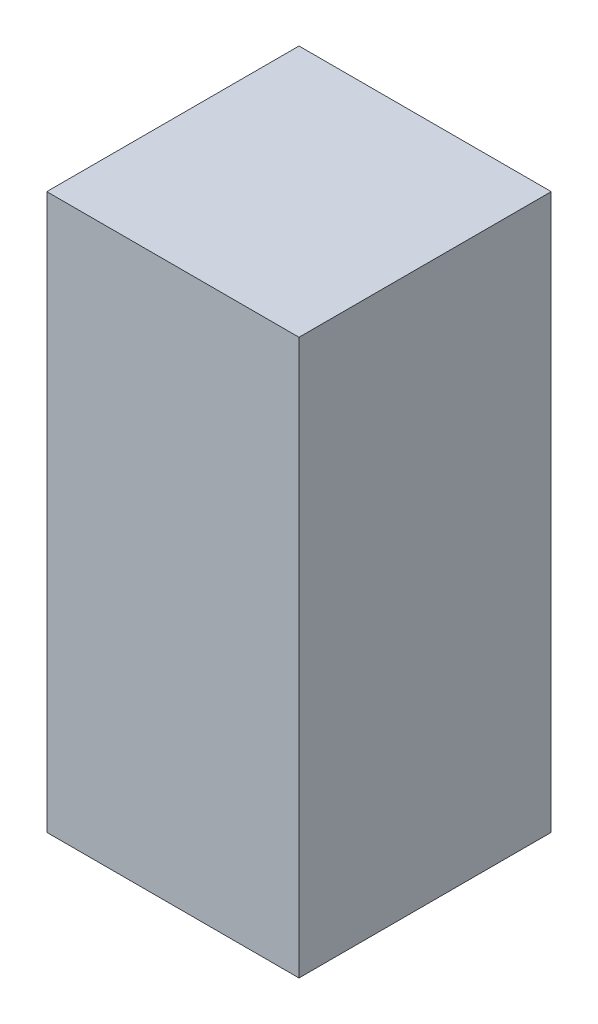
ISO-10303-21;
HEADER;
FILE_DESCRIPTION(('STEP AP214'),'2;1');
FILE_NAME('part.step','',(''),(''),'','','');
FILE_SCHEMA(('AUTOMOTIVE_DESIGN { 1 0 10303 214 1 1 1 1 }'));
ENDSEC;
DATA;
#1=APPLICATION_CONTEXT('core data for automotive mechanical design processes');
#2=APPLICATION_PROTOCOL_DEFINITION('international standard','automotive_design',2000,#1);
#3=PRODUCT_CONTEXT('',#1,'mechanical');
#4=PRODUCT('Part','Part','',(#3));
#5=PRODUCT_RELATED_PRODUCT_CATEGORY('part','',(#4));
#6=PRODUCT_DEFINITION_FORMATION('','',#4);
#7=PRODUCT_DEFINITION_CONTEXT('part definition',#1,'design');
#8=PRODUCT_DEFINITION('design','',#6,#7);
#9=PRODUCT_DEFINITION_SHAPE('','',#8);
#10=(LENGTH_UNIT() NAMED_UNIT(*) SI_UNIT(.MILLI.,.METRE.));
#11=(NAMED_UNIT(*) PLANE_ANGLE_UNIT() SI_UNIT($,.RADIAN.));
#12=(NAMED_UNIT(*) SI_UNIT($,.STERADIAN.) SOLID_ANGLE_UNIT());
#13=UNCERTAINTY_MEASURE_WITH_UNIT(LENGTH_MEASURE(1.E-05),#10,'distance_accuracy_value','');
#14=(GEOMETRIC_REPRESENTATION_CONTEXT(3) GLOBAL_UNCERTAINTY_ASSIGNED_CONTEXT((#13)) GLOBAL_UNIT_ASSIGNED_CONTEXT((#10,
#11,#12)) REPRESENTATION_CONTEXT('',''));
#15=CARTESIAN_POINT('',(0.,0.,0.));
#16=DIRECTION('',(0.,0.,1.));
#17=DIRECTION('',(1.,0.,0.));
#18=AXIS2_PLACEMENT_3D('',#15,#16,#17);
#19=CARTESIAN_POINT('',(-12.5,55.,-12.5));
#20=DIRECTION('',(0.,0.,-1.));
#21=DIRECTION('',(-1.,0.,0.));
#22=AXIS2_PLACEMENT_3D('',#19,#20,#21);
#23=PLANE('',#22);
#24=DIRECTION('',(1.,0.,0.));
#25=VECTOR('',#24,1.);
#26=CARTESIAN_POINT('',(-12.5,0.,-12.5));
#27=LINE('',#26,#25);
#28=CARTESIAN_POINT('',(-12.5,0.,-12.5));
#29=VERTEX_POINT('',#28);
#30=CARTESIAN_POINT('',(12.5,0.,-12.5));
#31=VERTEX_POINT('',#30);
#32=EDGE_CURVE('E116',#29,#31,#27,.T.);
#33=ORIENTED_EDGE('',*,*,#32,.F.);
#34=DIRECTION('',(0.,-1.,0.));
#35=VECTOR('',#34,1.);
#36=CARTESIAN_POINT('',(-12.5,55.,-12.5));
#37=LINE('',#36,#35);
#38=CARTESIAN_POINT('',(-12.5,55.,-12.5));
#39=VERTEX_POINT('',#38);
#40=EDGE_CURVE('E11',#39,#29,#37,.T.);
#41=ORIENTED_EDGE('',*,*,#40,.F.);
#42=DIRECTION('',(1.,0.,0.));
#43=VECTOR('',#42,1.);
#44=CARTESIAN_POINT('',(-12.5,55.,-12.5));
#45=LINE('',#44,#43);
#46=CARTESIAN_POINT('',(12.5,55.,-12.5));
#47=VERTEX_POINT('',#46);
#48=EDGE_CURVE('E109',#39,#47,#45,.T.);
#49=ORIENTED_EDGE('',*,*,#48,.T.);
#50=DIRECTION('',(0.,-1.,0.));
#51=VECTOR('',#50,1.);
#52=CARTESIAN_POINT('',(12.5,55.,-12.5));
#53=LINE('',#52,#51);
#54=EDGE_CURVE('E48',#47,#31,#53,.T.);
#55=ORIENTED_EDGE('',*,*,#54,.T.);
#56=EDGE_LOOP('',(#33,#41,#49,#55));
#57=FACE_BOUND('',#56,.T.);
#58=ADVANCED_FACE('F45',(#57),#23,.T.);
#59=CARTESIAN_POINT('',(-12.5,55.,-12.5));
#60=DIRECTION('',(1.,0.,0.));
#61=DIRECTION('',(0.,0.,-1.));
#62=AXIS2_PLACEMENT_3D('',#59,#60,#61);
#63=PLANE('',#62);
#64=DIRECTION('',(0.,0.,1.));
#65=VECTOR('',#64,1.);
#66=CARTESIAN_POINT('',(-12.5,0.,-12.5));
#67=LINE('',#66,#65);
#68=CARTESIAN_POINT('',(-12.5,0.,12.5));
#69=VERTEX_POINT('',#68);
#70=EDGE_CURVE('E79',#29,#69,#67,.T.);
#71=ORIENTED_EDGE('',*,*,#70,.T.);
#72=DIRECTION('',(0.,-1.,0.));
#73=VECTOR('',#72,1.);
#74=CARTESIAN_POINT('',(-12.5,55.,12.5));
#75=LINE('',#74,#73);
#76=CARTESIAN_POINT('',(-12.5,55.,12.5));
#77=VERTEX_POINT('',#76);
#78=EDGE_CURVE('E55',#77,#69,#75,.T.);
#79=ORIENTED_EDGE('',*,*,#78,.F.);
#80=DIRECTION('',(0.,0.,1.));
#81=VECTOR('',#80,1.);
#82=CARTESIAN_POINT('',(-12.5,55.,-12.5));
#83=LINE('',#82,#81);
#84=EDGE_CURVE('E96',#39,#77,#83,.T.);
#85=ORIENTED_EDGE('',*,*,#84,.F.);
#86=ORIENTED_EDGE('',*,*,#40,.T.);
#87=EDGE_LOOP('',(#71,#79,#85,#86));
#88=FACE_BOUND('',#87,.T.);
#89=ADVANCED_FACE('F132',(#88),#63,.F.);
#90=CARTESIAN_POINT('',(-12.5,55.,12.5));
#91=DIRECTION('',(0.,0.,-1.));
#92=DIRECTION('',(-1.,0.,0.));
#93=AXIS2_PLACEMENT_3D('',#90,#91,#92);
#94=PLANE('',#93);
#95=DIRECTION('',(1.,0.,0.));
#96=VECTOR('',#95,1.);
#97=CARTESIAN_POINT('',(-12.5,0.,12.5));
#98=LINE('',#97,#96);
#99=CARTESIAN_POINT('',(12.5,0.,12.5));
#100=VERTEX_POINT('',#99);
#101=EDGE_CURVE('E104',#69,#100,#98,.T.);
#102=ORIENTED_EDGE('',*,*,#101,.T.);
#103=DIRECTION('',(0.,-1.,0.));
#104=VECTOR('',#103,1.);
#105=CARTESIAN_POINT('',(12.5,55.,12.5));
#106=LINE('',#105,#104);
#107=CARTESIAN_POINT('',(12.5,55.,12.5));
#108=VERTEX_POINT('',#107);
#109=EDGE_CURVE('E101',#108,#100,#106,.T.);
#110=ORIENTED_EDGE('',*,*,#109,.F.);
#111=DIRECTION('',(1.,0.,0.));
#112=VECTOR('',#111,1.);
#113=CARTESIAN_POINT('',(-12.5,55.,12.5));
#114=LINE('',#113,#112);
#115=EDGE_CURVE('E91',#77,#108,#114,.T.);
#116=ORIENTED_EDGE('',*,*,#115,.F.);
#117=ORIENTED_EDGE('',*,*,#78,.T.);
#118=EDGE_LOOP('',(#102,#110,#116,#117));
#119=FACE_BOUND('',#118,.T.);
#120=ADVANCED_FACE('F102',(#119),#94,.F.);
#121=CARTESIAN_POINT('',(12.5,55.,-12.5));
#122=DIRECTION('',(1.,0.,0.));
#123=DIRECTION('',(0.,0.,-1.));
#124=AXIS2_PLACEMENT_3D('',#121,#122,#123);
#125=PLANE('',#124);
#126=DIRECTION('',(0.,0.,1.));
#127=VECTOR('',#126,1.);
#128=CARTESIAN_POINT('',(12.5,0.,-12.5));
#129=LINE('',#128,#127);
#130=EDGE_CURVE('E120',#31,#100,#129,.T.);
#131=ORIENTED_EDGE('',*,*,#130,.F.);
#132=ORIENTED_EDGE('',*,*,#54,.F.);
#133=DIRECTION('',(0.,0.,1.));
#134=VECTOR('',#133,1.);
#135=CARTESIAN_POINT('',(12.5,55.,-12.5));
#136=LINE('',#135,#134);
#137=EDGE_CURVE('E95',#47,#108,#136,.T.);
#138=ORIENTED_EDGE('',*,*,#137,.T.);
#139=ORIENTED_EDGE('',*,*,#109,.T.);
#140=EDGE_LOOP('',(#131,#132,#138,#139));
#141=FACE_BOUND('',#140,.T.);
#142=ADVANCED_FACE('F107',(#141),#125,.T.);
#143=CARTESIAN_POINT('',(0.,55.,0.));
#144=DIRECTION('',(0.,-1.,0.));
#145=DIRECTION('',(0.,0.,-1.));
#146=AXIS2_PLACEMENT_3D('',#143,#144,#145);
#147=PLANE('',#146);
#148=ORIENTED_EDGE('',*,*,#48,.F.);
#149=ORIENTED_EDGE('',*,*,#84,.T.);
#150=ORIENTED_EDGE('',*,*,#115,.T.);
#151=ORIENTED_EDGE('',*,*,#137,.F.);
#152=EDGE_LOOP('',(#148,#149,#150,#151));
#153=FACE_BOUND('',#152,.T.);
#154=ADVANCED_FACE('F94',(#153),#147,.F.);
#155=CARTESIAN_POINT('',(0.,0.,0.));
#156=DIRECTION('',(0.,-1.,0.));
#157=DIRECTION('',(0.,0.,-1.));
#158=AXIS2_PLACEMENT_3D('',#155,#156,#157);
#159=PLANE('',#158);
#160=ORIENTED_EDGE('',*,*,#32,.T.);
#161=ORIENTED_EDGE('',*,*,#130,.T.);
#162=ORIENTED_EDGE('',*,*,#101,.F.);
#163=ORIENTED_EDGE('',*,*,#70,.F.);
#164=EDGE_LOOP('',(#160,#161,#162,#163));
#165=FACE_BOUND('',#164,.T.);
#166=ADVANCED_FACE('F129',(#165),#159,.T.);
#167=CLOSED_SHELL('',(#58,#89,#120,#142,#154,#166));
#168=MANIFOLD_SOLID_BREP('B2',#167);
#169=ADVANCED_BREP_SHAPE_REPRESENTATION('',(#18,#168),#14);
#170=SHAPE_DEFINITION_REPRESENTATION(#9,#169);
ENDSEC;
END-ISO-10303-21;
